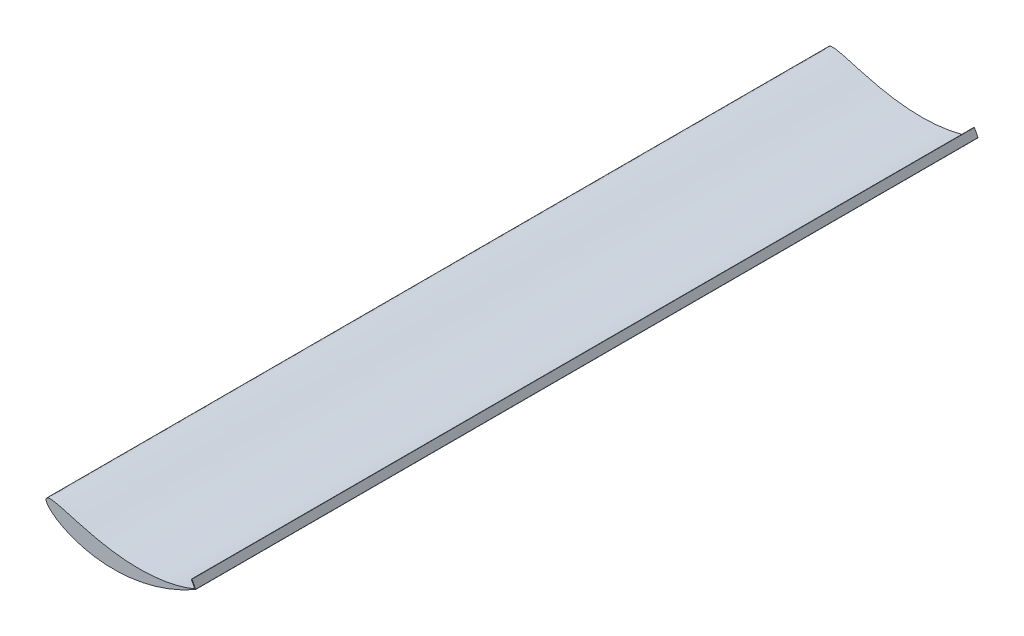
ISO-10303-21;
HEADER;
FILE_DESCRIPTION(('STEP AP214'),'2;1');
FILE_NAME('part.step','',(''),(''),'','','');
FILE_SCHEMA(('AUTOMOTIVE_DESIGN { 1 0 10303 214 1 1 1 1 }'));
ENDSEC;
DATA;
#1=APPLICATION_CONTEXT('core data for automotive mechanical design processes');
#2=APPLICATION_PROTOCOL_DEFINITION('international standard','automotive_design',2000,#1);
#3=PRODUCT_CONTEXT('',#1,'mechanical');
#4=PRODUCT('Part','Part','',(#3));
#5=PRODUCT_RELATED_PRODUCT_CATEGORY('part','',(#4));
#6=PRODUCT_DEFINITION_FORMATION('','',#4);
#7=PRODUCT_DEFINITION_CONTEXT('part definition',#1,'design');
#8=PRODUCT_DEFINITION('design','',#6,#7);
#9=PRODUCT_DEFINITION_SHAPE('','',#8);
#10=(LENGTH_UNIT() NAMED_UNIT(*) SI_UNIT(.MILLI.,.METRE.));
#11=(NAMED_UNIT(*) PLANE_ANGLE_UNIT() SI_UNIT($,.RADIAN.));
#12=(NAMED_UNIT(*) SI_UNIT($,.STERADIAN.) SOLID_ANGLE_UNIT());
#13=UNCERTAINTY_MEASURE_WITH_UNIT(LENGTH_MEASURE(1.E-05),#10,'distance_accuracy_value','');
#14=(GEOMETRIC_REPRESENTATION_CONTEXT(3) GLOBAL_UNCERTAINTY_ASSIGNED_CONTEXT((#13)) GLOBAL_UNIT_ASSIGNED_CONTEXT((#10,
#11,#12)) REPRESENTATION_CONTEXT('',''));
#15=CARTESIAN_POINT('',(0.,0.,0.));
#16=DIRECTION('',(0.,0.,1.));
#17=DIRECTION('',(1.,0.,0.));
#18=AXIS2_PLACEMENT_3D('',#15,#16,#17);
#19=CARTESIAN_POINT('',(190.788109023856,-4.44546458104487,500.));
#20=DIRECTION('',(0.,0.,-1.));
#21=DIRECTION('',(-1.,0.,0.));
#22=AXIS2_PLACEMENT_3D('',#19,#20,#21);
#23=CYLINDRICAL_SURFACE('',#22,0.372057255621975);
#24=CARTESIAN_POINT('',(190.788109023856,-4.44546458104487,-500.));
#25=DIRECTION('',(0.,0.,-1.));
#26=DIRECTION('',(-1.,0.,0.));
#27=AXIS2_PLACEMENT_3D('',#24,#25,#26);
#28=CIRCLE('',#27,0.372057255621975);
#29=CARTESIAN_POINT('',(191.120009682885,-4.27733203215238,-500.));
#30=VERTEX_POINT('',#29);
#31=CARTESIAN_POINT('',(190.956241572749,-4.7773652400738,-500.));
#32=VERTEX_POINT('',#31);
#33=EDGE_CURVE('E116',#30,#32,#28,.T.);
#34=ORIENTED_EDGE('',*,*,#33,.F.);
#35=DIRECTION('',(0.,0.,-1.));
#36=VECTOR('',#35,1.);
#37=CARTESIAN_POINT('',(191.120009682885,-4.27733203215238,500.));
#38=LINE('',#37,#36);
#39=CARTESIAN_POINT('',(191.120009682885,-4.27733203215238,500.));
#40=VERTEX_POINT('',#39);
#41=EDGE_CURVE('E11',#40,#30,#38,.T.);
#42=ORIENTED_EDGE('',*,*,#41,.F.);
#43=CARTESIAN_POINT('',(190.788109023856,-4.44546458104487,500.));
#44=DIRECTION('',(0.,0.,-1.));
#45=DIRECTION('',(-1.,0.,0.));
#46=AXIS2_PLACEMENT_3D('',#43,#44,#45);
#47=CIRCLE('',#46,0.372057255621975);
#48=CARTESIAN_POINT('',(190.956241572749,-4.7773652400738,500.));
#49=VERTEX_POINT('',#48);
#50=EDGE_CURVE('E108',#40,#49,#47,.T.);
#51=ORIENTED_EDGE('',*,*,#50,.T.);
#52=DIRECTION('',(0.,0.,-1.));
#53=VECTOR('',#52,1.);
#54=CARTESIAN_POINT('',(190.956241572749,-4.7773652400738,500.));
#55=LINE('',#54,#53);
#56=EDGE_CURVE('E37',#49,#32,#55,.T.);
#57=ORIENTED_EDGE('',*,*,#56,.T.);
#58=EDGE_LOOP('',(#34,#42,#51,#57));
#59=FACE_BOUND('',#58,.T.);
#60=ADVANCED_FACE('F34',(#59),#23,.T.);
#61=CARTESIAN_POINT('',(191.120009682885,-4.27733203215238,500.));
#62=DIRECTION('',(-0.892068771711316,-0.451899664236946,0.));
#63=DIRECTION('',(0.451899664236946,-0.892068771711316,0.));
#64=AXIS2_PLACEMENT_3D('',#61,#62,#63);
#65=PLANE('',#64);
#66=DIRECTION('',(-0.451899664236946,0.892068771711316,0.));
#67=VECTOR('',#66,1.);
#68=CARTESIAN_POINT('',(191.120009682885,-4.27733203215238,-500.));
#69=LINE('',#68,#67);
#70=CARTESIAN_POINT('',(186.601013040516,4.64335568496094,-500.));
#71=VERTEX_POINT('',#70);
#72=EDGE_CURVE('E70',#30,#71,#69,.T.);
#73=ORIENTED_EDGE('',*,*,#72,.T.);
#74=DIRECTION('',(0.,0.,-1.));
#75=VECTOR('',#74,1.);
#76=CARTESIAN_POINT('',(186.601013040516,4.64335568496094,500.));
#77=LINE('',#76,#75);
#78=CARTESIAN_POINT('',(186.601013040516,4.64335568496094,500.));
#79=VERTEX_POINT('',#78);
#80=EDGE_CURVE('E43',#79,#71,#77,.T.);
#81=ORIENTED_EDGE('',*,*,#80,.F.);
#82=DIRECTION('',(-0.451899664236946,0.892068771711316,0.));
#83=VECTOR('',#82,1.);
#84=CARTESIAN_POINT('',(191.120009682885,-4.27733203215238,500.));
#85=LINE('',#84,#83);
#86=EDGE_CURVE('E92',#40,#79,#85,.T.);
#87=ORIENTED_EDGE('',*,*,#86,.F.);
#88=ORIENTED_EDGE('',*,*,#41,.T.);
#89=EDGE_LOOP('',(#73,#81,#87,#88));
#90=FACE_BOUND('',#89,.T.);
#91=ADVANCED_FACE('F142',(#90),#65,.F.);
#92=CARTESIAN_POINT('',(186.601013040516,4.64335568496094,500.));
#93=DIRECTION('',(0.451899664236964,-0.892068771711307,0.));
#94=DIRECTION('',(0.892068771711307,0.451899664236964,0.));
#95=AXIS2_PLACEMENT_3D('',#92,#93,#94);
#96=PLANE('',#95);
#97=DIRECTION('',(-0.892068771711307,-0.451899664236963,0.));
#98=VECTOR('',#97,1.);
#99=CARTESIAN_POINT('',(186.601013040516,4.64335568496094,-500.));
#100=LINE('',#99,#98);
#101=CARTESIAN_POINT('',(185.708944268804,4.19145602072398,-500.));
#102=VERTEX_POINT('',#101);
#103=EDGE_CURVE('E99',#71,#102,#100,.T.);
#104=ORIENTED_EDGE('',*,*,#103,.T.);
#105=DIRECTION('',(0.,0.,-1.));
#106=VECTOR('',#105,1.);
#107=CARTESIAN_POINT('',(185.708944268804,4.19145602072398,500.));
#108=LINE('',#107,#106);
#109=CARTESIAN_POINT('',(185.708944268804,4.19145602072398,500.));
#110=VERTEX_POINT('',#109);
#111=EDGE_CURVE('E96',#110,#102,#108,.T.);
#112=ORIENTED_EDGE('',*,*,#111,.F.);
#113=DIRECTION('',(-0.892068771711307,-0.451899664236963,0.));
#114=VECTOR('',#113,1.);
#115=CARTESIAN_POINT('',(186.601013040516,4.64335568496094,500.));
#116=LINE('',#115,#114);
#117=EDGE_CURVE('E85',#79,#110,#116,.T.);
#118=ORIENTED_EDGE('',*,*,#117,.F.);
#119=ORIENTED_EDGE('',*,*,#80,.T.);
#120=EDGE_LOOP('',(#104,#112,#118,#119));
#121=FACE_BOUND('',#120,.T.);
#122=ADVANCED_FACE('F97',(#121),#96,.F.);
#123=CARTESIAN_POINT('',(185.708944268804,4.19145602072398,500.));
#124=DIRECTION('',(0.892068771711315,0.451899664236947,0.));
#125=DIRECTION('',(-0.451899664236947,0.892068771711315,0.));
#126=AXIS2_PLACEMENT_3D('',#123,#124,#125);
#127=PLANE('',#126);
#128=DIRECTION('',(0.451899664236947,-0.892068771711315,0.));
#129=VECTOR('',#128,1.);
#130=CARTESIAN_POINT('',(185.708944268804,4.19145602072398,-500.));
#131=LINE('',#130,#129);
#132=CARTESIAN_POINT('',(190.040066051967,-4.35835889396931,-500.));
#133=VERTEX_POINT('',#132);
#134=EDGE_CURVE('E124',#102,#133,#131,.T.);
#135=ORIENTED_EDGE('',*,*,#134,.T.);
#136=DIRECTION('',(0.,0.,-1.));
#137=VECTOR('',#136,1.);
#138=CARTESIAN_POINT('',(190.040066051967,-4.35835889396931,500.));
#139=LINE('',#138,#137);
#140=CARTESIAN_POINT('',(190.040066051967,-4.35835889396931,500.));
#141=VERTEX_POINT('',#140);
#142=EDGE_CURVE('E103',#141,#133,#139,.T.);
#143=ORIENTED_EDGE('',*,*,#142,.F.);
#144=DIRECTION('',(0.451899664236947,-0.892068771711315,0.));
#145=VECTOR('',#144,1.);
#146=CARTESIAN_POINT('',(185.708944268804,4.19145602072398,500.));
#147=LINE('',#146,#145);
#148=EDGE_CURVE('E90',#110,#141,#147,.T.);
#149=ORIENTED_EDGE('',*,*,#148,.F.);
#150=ORIENTED_EDGE('',*,*,#111,.T.);
#151=EDGE_LOOP('',(#135,#143,#149,#150));
#152=FACE_BOUND('',#151,.T.);
#153=ADVANCED_FACE('F105',(#152),#127,.F.);
#154=CARTESIAN_POINT('',(190.956241572749,-4.7773652400738,500.));
#155=CARTESIAN_POINT('',(190.824351331435,-4.85073465637911,500.));
#156=CARTESIAN_POINT('',(189.266236246989,-5.71631154867927,500.));
#157=CARTESIAN_POINT('',(186.010858372446,-7.49360526460153,500.));
#158=CARTESIAN_POINT('',(180.823647875429,-10.2147269313576,500.));
#159=CARTESIAN_POINT('',(174.698235283672,-13.2560143177396,500.));
#160=CARTESIAN_POINT('',(167.59135908908,-16.5395762823449,500.));
#161=CARTESIAN_POINT('',(159.48834975273,-19.9547276540953,500.));
#162=CARTESIAN_POINT('',(150.393963734915,-23.3650509430077,500.));
#163=CARTESIAN_POINT('',(140.348546412923,-26.6128977934457,500.));
#164=CARTESIAN_POINT('',(129.433550223174,-29.5248982498167,500.));
#165=CARTESIAN_POINT('',(117.779572076668,-31.9239998784419,500.));
#166=CARTESIAN_POINT('',(105.569465285836,-33.648313549697,500.));
#167=CARTESIAN_POINT('',(93.0340059448322,-34.5635604701211,500.));
#168=CARTESIAN_POINT('',(80.4426492143391,-34.5850966651918,500.));
#169=CARTESIAN_POINT('',(68.0856866427688,-33.6870014790861,500.));
#170=CARTESIAN_POINT('',(56.2532972721014,-31.9099389515743,500.));
#171=CARTESIAN_POINT('',(45.2122676293166,-29.3578213920277,500.));
#172=CARTESIAN_POINT('',(35.1865501798599,-26.1864686157695,500.));
#173=CARTESIAN_POINT('',(26.3435491944197,-22.5854032327318,500.));
#174=CARTESIAN_POINT('',(18.78766503966,-18.7593018238579,500.));
#175=CARTESIAN_POINT('',(12.5632967155241,-14.9069364714745,500.));
#176=CARTESIAN_POINT('',(7.66020675550264,-11.2052846726491,500.));
#177=CARTESIAN_POINT('',(4.02760427497412,-7.8032487843966,500.));
#178=CARTESIAN_POINT('',(1.57365300949457,-4.79629138390064,500.));
#179=CARTESIAN_POINT('',(0.201464861565747,-2.25266289924747,500.));
#180=CARTESIAN_POINT('',(-0.21347160418932,-0.0689899999356164,500.));
#181=CARTESIAN_POINT('',(0.597068392516821,1.67497748421285,500.));
#182=CARTESIAN_POINT('',(2.3572122834409,2.58171887971936,500.));
#183=CARTESIAN_POINT('',(4.67296200232916,2.91910757200338,500.));
#184=CARTESIAN_POINT('',(7.60211655207605,2.83089667814873,500.));
#185=CARTESIAN_POINT('',(11.0991655086455,2.3531256256347,500.));
#186=CARTESIAN_POINT('',(15.1231444610723,1.53898804204561,500.));
#187=CARTESIAN_POINT('',(19.62268108885,0.440148355950823,500.));
#188=CARTESIAN_POINT('',(24.5519108282923,-0.886957346281386,500.));
#189=CARTESIAN_POINT('',(29.8679079946093,-2.38631354466659,500.));
#190=CARTESIAN_POINT('',(35.5308012730812,-4.00395214540364,500.));
#191=CARTESIAN_POINT('',(41.5033811180277,-5.68788873006616,500.));
#192=CARTESIAN_POINT('',(47.7502444833533,-7.38908141809133,500.));
#193=CARTESIAN_POINT('',(54.2367198881838,-9.06393435203337,500.));
#194=CARTESIAN_POINT('',(60.9292278258349,-10.6713318543495,500.));
#195=CARTESIAN_POINT('',(67.7943227961277,-12.1754460365013,500.));
#196=CARTESIAN_POINT('',(74.7986122859653,-13.5446925307062,500.));
#197=CARTESIAN_POINT('',(81.9087400099977,-14.751698968136,500.));
#198=CARTESIAN_POINT('',(89.0909511374897,-15.7746996543962,500.));
#199=CARTESIAN_POINT('',(96.3114483948899,-16.5950320077416,500.));
#200=CARTESIAN_POINT('',(103.536162889798,-17.1998293144592,500.));
#201=CARTESIAN_POINT('',(110.730986166223,-17.580161629818,500.));
#202=CARTESIAN_POINT('',(117.861845411539,-17.731640772723,500.));
#203=CARTESIAN_POINT('',(124.894874309783,-17.6543258949296,500.));
#204=CARTESIAN_POINT('',(131.796397968462,-17.3523205741085,500.));
#205=CARTESIAN_POINT('',(138.533291684862,-16.8343407675229,500.));
#206=CARTESIAN_POINT('',(145.072823386818,-16.1129291514206,500.));
#207=CARTESIAN_POINT('',(151.38319489256,-15.2048583413816,500.));
#208=CARTESIAN_POINT('',(157.433178918403,-14.1299771308705,500.));
#209=CARTESIAN_POINT('',(163.192716512034,-12.9123836369806,500.));
#210=CARTESIAN_POINT('',(168.632500234805,-11.5794794515556,500.));
#211=CARTESIAN_POINT('',(173.724620383399,-10.1623727858618,500.));
#212=CARTESIAN_POINT('',(178.441318244862,-8.69364484056416,500.));
#213=CARTESIAN_POINT('',(182.756848014337,-7.2104631039453,500.));
#214=CARTESIAN_POINT('',(186.582564299203,-5.77471827443922,500.));
#215=CARTESIAN_POINT('',(188.958215485214,-4.81222031231766,500.));
#216=CARTESIAN_POINT('',(190.040066051967,-4.35835889396931,500.));
#217=B_SPLINE_CURVE_WITH_KNOTS('',3,(#154,#155,#156,#157,#158,#159,#160,#161,#162,#163,#164,
#165,#166,#167,#168,#169,#170,#171,#172,#173,#174,#175,#176,#177,#178,#179,#180,#181,#182,#183,
#184,#185,#186,#187,#188,#189,#190,#191,#192,#193,#194,#195,#196,#197,#198,#199,#200,#201,#202,
#203,#204,#205,#206,#207,#208,#209,#210,#211,#212,#213,#214,#215,#216),.UNSPECIFIED.,.F.,.F.,(4,
1,1,1,1,1,1,1,1,1,1,1,1,1,1,1,1,1,1,1,1,1,1,1,1,1,1,1,1,1,1,1,1,1,1,1,1,1,1,1,1,1,1,1,1,1,1,1,1,
1,1,1,1,1,1,1,1,1,1,1,4),(0.0245276990923007,0.0255892091094669,0.037067816404931,
0.0508545016176155,0.0669850232537373,0.0854578364560865,0.106225288239911,0.12917998384715,
0.154148680118291,0.180883335079671,0.209058051835446,0.238271881003164,0.268058237582787,
0.297903876235442,0.327269841048481,0.355623841618484,0.382465396579952,0.407355501459855,
0.429934859408064,0.44993897241164,0.467201510337176,0.481654743678724,0.493326475768122,
0.502345383546677,0.508967218144621,0.513683958526164,0.517466280768162,0.521650737101246,
0.527066359245362,0.533951818546579,0.542299609164813,0.552017630625205,0.562981800758078,
0.575062674605368,0.58812908832469,0.602056581828096,0.616727009192038,0.632028813514711,
0.647858179931905,0.664118458358625,0.680718253960307,0.697573163857051,0.714603084498674,
0.731732437979172,0.748889668859815,0.766005494621813,0.783014284870449,0.799851871116559,
0.816455186450603,0.832763308706103,0.848714237871263,0.864246916691086,0.879299021901587,
0.893808281163375,0.907709696319397,0.920937866660647,0.933423618359619,0.945096561860754,
0.955881368680516,0.965700785345497,0.974004747643655),.UNSPECIFIED.);
#218=DIRECTION('',(0.,0.,-1.));
#219=VECTOR('',#218,1.);
#220=SURFACE_OF_LINEAR_EXTRUSION('',#217,#219);
#221=CARTESIAN_POINT('',(190.956241572749,-4.7773652400738,-500.));
#222=CARTESIAN_POINT('',(190.824351331435,-4.85073465637911,-500.));
#223=CARTESIAN_POINT('',(189.266236246989,-5.71631154867927,-500.));
#224=CARTESIAN_POINT('',(186.010858372446,-7.49360526460153,-500.));
#225=CARTESIAN_POINT('',(180.823647875429,-10.2147269313576,-500.));
#226=CARTESIAN_POINT('',(174.698235283672,-13.2560143177396,-500.));
#227=CARTESIAN_POINT('',(167.59135908908,-16.5395762823449,-500.));
#228=CARTESIAN_POINT('',(159.48834975273,-19.9547276540953,-500.));
#229=CARTESIAN_POINT('',(150.393963734915,-23.3650509430077,-500.));
#230=CARTESIAN_POINT('',(140.348546412923,-26.6128977934457,-500.));
#231=CARTESIAN_POINT('',(129.433550223174,-29.5248982498167,-500.));
#232=CARTESIAN_POINT('',(117.779572076668,-31.9239998784419,-500.));
#233=CARTESIAN_POINT('',(105.569465285836,-33.648313549697,-500.));
#234=CARTESIAN_POINT('',(93.0340059448322,-34.5635604701211,-500.));
#235=CARTESIAN_POINT('',(80.4426492143391,-34.5850966651918,-500.));
#236=CARTESIAN_POINT('',(68.0856866427688,-33.6870014790861,-500.));
#237=CARTESIAN_POINT('',(56.2532972721014,-31.9099389515743,-500.));
#238=CARTESIAN_POINT('',(45.2122676293166,-29.3578213920277,-500.));
#239=CARTESIAN_POINT('',(35.1865501798599,-26.1864686157695,-500.));
#240=CARTESIAN_POINT('',(26.3435491944197,-22.5854032327318,-500.));
#241=CARTESIAN_POINT('',(18.78766503966,-18.7593018238579,-500.));
#242=CARTESIAN_POINT('',(12.5632967155241,-14.9069364714745,-500.));
#243=CARTESIAN_POINT('',(7.66020675550264,-11.2052846726491,-500.));
#244=CARTESIAN_POINT('',(4.02760427497412,-7.8032487843966,-500.));
#245=CARTESIAN_POINT('',(1.57365300949457,-4.79629138390064,-500.));
#246=CARTESIAN_POINT('',(0.201464861565747,-2.25266289924747,-500.));
#247=CARTESIAN_POINT('',(-0.21347160418932,-0.0689899999356164,-500.));
#248=CARTESIAN_POINT('',(0.597068392516821,1.67497748421285,-500.));
#249=CARTESIAN_POINT('',(2.3572122834409,2.58171887971936,-500.));
#250=CARTESIAN_POINT('',(4.67296200232916,2.91910757200338,-500.));
#251=CARTESIAN_POINT('',(7.60211655207605,2.83089667814873,-500.));
#252=CARTESIAN_POINT('',(11.0991655086455,2.3531256256347,-500.));
#253=CARTESIAN_POINT('',(15.1231444610723,1.53898804204561,-500.));
#254=CARTESIAN_POINT('',(19.62268108885,0.440148355950823,-500.));
#255=CARTESIAN_POINT('',(24.5519108282923,-0.886957346281386,-500.));
#256=CARTESIAN_POINT('',(29.8679079946093,-2.38631354466659,-500.));
#257=CARTESIAN_POINT('',(35.5308012730812,-4.00395214540364,-500.));
#258=CARTESIAN_POINT('',(41.5033811180277,-5.68788873006616,-500.));
#259=CARTESIAN_POINT('',(47.7502444833533,-7.38908141809133,-500.));
#260=CARTESIAN_POINT('',(54.2367198881838,-9.06393435203337,-500.));
#261=CARTESIAN_POINT('',(60.9292278258349,-10.6713318543495,-500.));
#262=CARTESIAN_POINT('',(67.7943227961277,-12.1754460365013,-500.));
#263=CARTESIAN_POINT('',(74.7986122859653,-13.5446925307062,-500.));
#264=CARTESIAN_POINT('',(81.9087400099977,-14.751698968136,-500.));
#265=CARTESIAN_POINT('',(89.0909511374897,-15.7746996543962,-500.));
#266=CARTESIAN_POINT('',(96.3114483948899,-16.5950320077416,-500.));
#267=CARTESIAN_POINT('',(103.536162889798,-17.1998293144592,-500.));
#268=CARTESIAN_POINT('',(110.730986166223,-17.580161629818,-500.));
#269=CARTESIAN_POINT('',(117.861845411539,-17.731640772723,-500.));
#270=CARTESIAN_POINT('',(124.894874309783,-17.6543258949296,-500.));
#271=CARTESIAN_POINT('',(131.796397968462,-17.3523205741085,-500.));
#272=CARTESIAN_POINT('',(138.533291684862,-16.8343407675229,-500.));
#273=CARTESIAN_POINT('',(145.072823386818,-16.1129291514206,-500.));
#274=CARTESIAN_POINT('',(151.38319489256,-15.2048583413816,-500.));
#275=CARTESIAN_POINT('',(157.433178918403,-14.1299771308705,-500.));
#276=CARTESIAN_POINT('',(163.192716512034,-12.9123836369806,-500.));
#277=CARTESIAN_POINT('',(168.632500234805,-11.5794794515556,-500.));
#278=CARTESIAN_POINT('',(173.724620383399,-10.1623727858618,-500.));
#279=CARTESIAN_POINT('',(178.441318244862,-8.69364484056416,-500.));
#280=CARTESIAN_POINT('',(182.756848014337,-7.2104631039453,-500.));
#281=CARTESIAN_POINT('',(186.582564299203,-5.77471827443922,-500.));
#282=CARTESIAN_POINT('',(188.958215485214,-4.81222031231766,-500.));
#283=CARTESIAN_POINT('',(190.040066051967,-4.35835889396931,-500.));
#284=B_SPLINE_CURVE_WITH_KNOTS('',3,(#221,#222,#223,#224,#225,#226,#227,#228,#229,#230,#231,
#232,#233,#234,#235,#236,#237,#238,#239,#240,#241,#242,#243,#244,#245,#246,#247,#248,#249,#250,
#251,#252,#253,#254,#255,#256,#257,#258,#259,#260,#261,#262,#263,#264,#265,#266,#267,#268,#269,
#270,#271,#272,#273,#274,#275,#276,#277,#278,#279,#280,#281,#282,#283),.UNSPECIFIED.,.F.,.F.,(4,
1,1,1,1,1,1,1,1,1,1,1,1,1,1,1,1,1,1,1,1,1,1,1,1,1,1,1,1,1,1,1,1,1,1,1,1,1,1,1,1,1,1,1,1,1,1,1,1,
1,1,1,1,1,1,1,1,1,1,1,4),(0.0245276990923007,0.0255892091094669,0.037067816404931,
0.0508545016176155,0.0669850232537373,0.0854578364560865,0.106225288239911,0.12917998384715,
0.154148680118291,0.180883335079671,0.209058051835446,0.238271881003164,0.268058237582787,
0.297903876235442,0.327269841048481,0.355623841618484,0.382465396579952,0.407355501459855,
0.429934859408064,0.44993897241164,0.467201510337176,0.481654743678724,0.493326475768122,
0.502345383546677,0.508967218144621,0.513683958526164,0.517466280768162,0.521650737101246,
0.527066359245362,0.533951818546579,0.542299609164813,0.552017630625205,0.562981800758078,
0.575062674605368,0.58812908832469,0.602056581828096,0.616727009192038,0.632028813514711,
0.647858179931905,0.664118458358625,0.680718253960307,0.697573163857051,0.714603084498674,
0.731732437979172,0.748889668859815,0.766005494621813,0.783014284870449,0.799851871116559,
0.816455186450603,0.832763308706103,0.848714237871263,0.864246916691086,0.879299021901587,
0.893808281163375,0.907709696319397,0.920937866660647,0.933423618359619,0.945096561860754,
0.955881368680516,0.965700785345497,0.974004747643655),.UNSPECIFIED.);
#285=EDGE_CURVE('E119',#32,#133,#284,.T.);
#286=ORIENTED_EDGE('',*,*,#285,.F.);
#287=ORIENTED_EDGE('',*,*,#56,.F.);
#288=EDGE_CURVE('E106',#49,#141,#217,.T.);
#289=ORIENTED_EDGE('',*,*,#288,.T.);
#290=ORIENTED_EDGE('',*,*,#142,.T.);
#291=EDGE_LOOP('',(#286,#287,#289,#290));
#292=FACE_BOUND('',#291,.T.);
#293=ADVANCED_FACE('F131',(#292),#220,.T.);
#294=CARTESIAN_POINT('',(190.788109023856,-4.44546458104487,500.));
#295=DIRECTION('',(0.,0.,-1.));
#296=DIRECTION('',(-1.,0.,0.));
#297=AXIS2_PLACEMENT_3D('',#294,#295,#296);
#298=PLANE('',#297);
#299=ORIENTED_EDGE('',*,*,#50,.F.);
#300=ORIENTED_EDGE('',*,*,#86,.T.);
#301=ORIENTED_EDGE('',*,*,#117,.T.);
#302=ORIENTED_EDGE('',*,*,#148,.T.);
#303=ORIENTED_EDGE('',*,*,#288,.F.);
#304=EDGE_LOOP('',(#299,#300,#301,#302,#303));
#305=FACE_BOUND('',#304,.T.);
#306=ADVANCED_FACE('F88',(#305),#298,.F.);
#307=CARTESIAN_POINT('',(190.788109023856,-4.44546458104487,-500.));
#308=DIRECTION('',(0.,0.,-1.));
#309=DIRECTION('',(-1.,0.,0.));
#310=AXIS2_PLACEMENT_3D('',#307,#308,#309);
#311=PLANE('',#310);
#312=ORIENTED_EDGE('',*,*,#33,.T.);
#313=ORIENTED_EDGE('',*,*,#285,.T.);
#314=ORIENTED_EDGE('',*,*,#134,.F.);
#315=ORIENTED_EDGE('',*,*,#103,.F.);
#316=ORIENTED_EDGE('',*,*,#72,.F.);
#317=EDGE_LOOP('',(#312,#313,#314,#315,#316));
#318=FACE_BOUND('',#317,.T.);
#319=ADVANCED_FACE('F133',(#318),#311,.T.);
#320=CLOSED_SHELL('',(#60,#91,#122,#153,#293,#306,#319));
#321=MANIFOLD_SOLID_BREP('B2',#320);
#322=ADVANCED_BREP_SHAPE_REPRESENTATION('',(#18,#321),#14);
#323=SHAPE_DEFINITION_REPRESENTATION(#9,#322);
ENDSEC;
END-ISO-10303-21;
